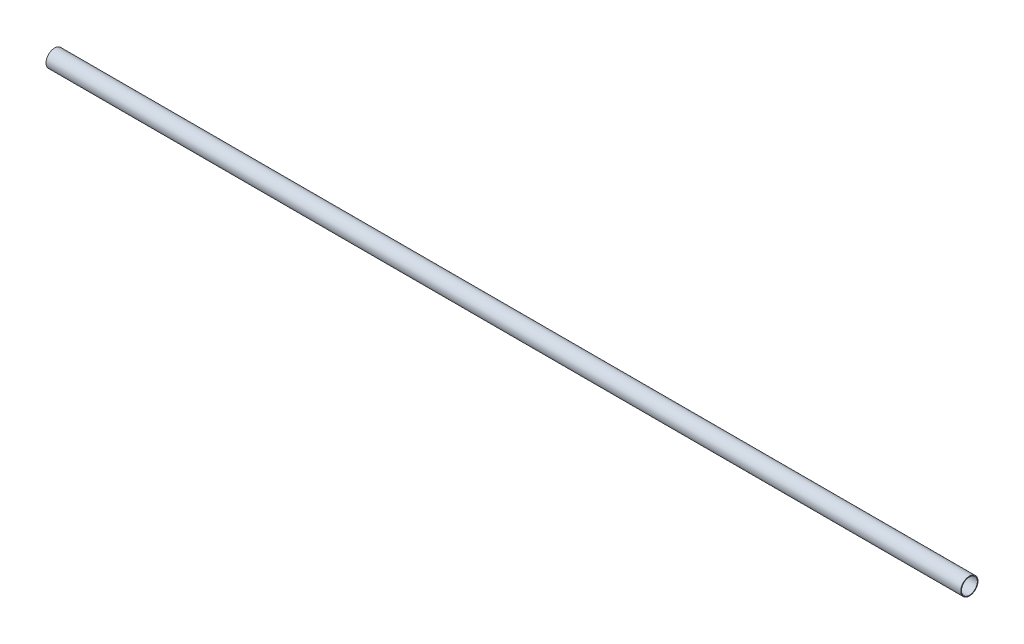
ISO-10303-21;
HEADER;
FILE_DESCRIPTION(('STEP AP214'),'2;1');
FILE_NAME('part.step','',(''),(''),'','','');
FILE_SCHEMA(('AUTOMOTIVE_DESIGN { 1 0 10303 214 1 1 1 1 }'));
ENDSEC;
DATA;
#1=APPLICATION_CONTEXT('core data for automotive mechanical design processes');
#2=APPLICATION_PROTOCOL_DEFINITION('international standard','automotive_design',2000,#1);
#3=PRODUCT_CONTEXT('',#1,'mechanical');
#4=PRODUCT('Part','Part','',(#3));
#5=PRODUCT_RELATED_PRODUCT_CATEGORY('part','',(#4));
#6=PRODUCT_DEFINITION_FORMATION('','',#4);
#7=PRODUCT_DEFINITION_CONTEXT('part definition',#1,'design');
#8=PRODUCT_DEFINITION('design','',#6,#7);
#9=PRODUCT_DEFINITION_SHAPE('','',#8);
#10=(LENGTH_UNIT() NAMED_UNIT(*) SI_UNIT(.MILLI.,.METRE.));
#11=(NAMED_UNIT(*) PLANE_ANGLE_UNIT() SI_UNIT($,.RADIAN.));
#12=(NAMED_UNIT(*) SI_UNIT($,.STERADIAN.) SOLID_ANGLE_UNIT());
#13=UNCERTAINTY_MEASURE_WITH_UNIT(LENGTH_MEASURE(1.E-05),#10,'distance_accuracy_value','');
#14=(GEOMETRIC_REPRESENTATION_CONTEXT(3) GLOBAL_UNCERTAINTY_ASSIGNED_CONTEXT((#13)) GLOBAL_UNIT_ASSIGNED_CONTEXT((#10,
#11,#12)) REPRESENTATION_CONTEXT('',''));
#15=CARTESIAN_POINT('',(0.,0.,0.));
#16=DIRECTION('',(0.,0.,1.));
#17=DIRECTION('',(1.,0.,0.));
#18=AXIS2_PLACEMENT_3D('',#15,#16,#17);
#19=CARTESIAN_POINT('',(1350.,0.,0.));
#20=DIRECTION('',(1.,0.,0.));
#21=DIRECTION('',(0.,0.,-1.));
#22=AXIS2_PLACEMENT_3D('',#19,#20,#21);
#23=PLANE('',#22);
#24=CARTESIAN_POINT('',(1350.,0.,0.));
#25=DIRECTION('',(1.,0.,0.));
#26=DIRECTION('',(0.,0.,-1.));
#27=AXIS2_PLACEMENT_3D('',#24,#25,#26);
#28=CIRCLE('',#27,25.4);
#29=CARTESIAN_POINT('',(1350.,0.,-25.4));
#30=VERTEX_POINT('',#29);
#31=EDGE_CURVE('E10',#30,#30,#28,.T.);
#32=ORIENTED_EDGE('',*,*,#31,.T.);
#33=EDGE_LOOP('',(#32));
#34=FACE_BOUND('',#33,.T.);
#35=CARTESIAN_POINT('',(1350.,0.,0.));
#36=DIRECTION('',(1.,0.,0.));
#37=DIRECTION('',(0.,0.,-1.));
#38=AXIS2_PLACEMENT_3D('',#35,#36,#37);
#39=CIRCLE('',#38,23.4);
#40=CARTESIAN_POINT('',(1350.,0.,-23.4));
#41=VERTEX_POINT('',#40);
#42=EDGE_CURVE('E42',#41,#41,#39,.T.);
#43=ORIENTED_EDGE('',*,*,#42,.F.);
#44=EDGE_LOOP('',(#43));
#45=FACE_BOUND('',#44,.T.);
#46=ADVANCED_FACE('F31',(#34,#45),#23,.T.);
#47=CARTESIAN_POINT('',(-1350.,0.,0.));
#48=DIRECTION('',(1.,0.,0.));
#49=DIRECTION('',(0.,0.,-1.));
#50=AXIS2_PLACEMENT_3D('',#47,#48,#49);
#51=PLANE('',#50);
#52=CARTESIAN_POINT('',(-1350.,0.,0.));
#53=DIRECTION('',(1.,0.,0.));
#54=DIRECTION('',(0.,0.,-1.));
#55=AXIS2_PLACEMENT_3D('',#52,#53,#54);
#56=CIRCLE('',#55,25.4);
#57=CARTESIAN_POINT('',(-1350.,0.,-25.4));
#58=VERTEX_POINT('',#57);
#59=EDGE_CURVE('E35',#58,#58,#56,.T.);
#60=ORIENTED_EDGE('',*,*,#59,.F.);
#61=EDGE_LOOP('',(#60));
#62=FACE_BOUND('',#61,.T.);
#63=CARTESIAN_POINT('',(-1350.,0.,0.));
#64=DIRECTION('',(1.,0.,0.));
#65=DIRECTION('',(0.,0.,-1.));
#66=AXIS2_PLACEMENT_3D('',#63,#64,#65);
#67=CIRCLE('',#66,23.4);
#68=CARTESIAN_POINT('',(-1350.,0.,-23.4));
#69=VERTEX_POINT('',#68);
#70=EDGE_CURVE('E44',#69,#69,#67,.T.);
#71=ORIENTED_EDGE('',*,*,#70,.T.);
#72=EDGE_LOOP('',(#71));
#73=FACE_BOUND('',#72,.T.);
#74=ADVANCED_FACE('F54',(#62,#73),#51,.F.);
#75=CARTESIAN_POINT('',(1350.,0.,0.));
#76=DIRECTION('',(-1.,0.,0.));
#77=DIRECTION('',(0.,0.,1.));
#78=AXIS2_PLACEMENT_3D('',#75,#76,#77);
#79=CYLINDRICAL_SURFACE('',#78,25.4);
#80=ORIENTED_EDGE('',*,*,#31,.F.);
#81=EDGE_LOOP('',(#80));
#82=FACE_BOUND('',#81,.T.);
#83=ORIENTED_EDGE('',*,*,#59,.T.);
#84=EDGE_LOOP('',(#83));
#85=FACE_BOUND('',#84,.T.);
#86=ADVANCED_FACE('F33',(#82,#85),#79,.T.);
#87=CARTESIAN_POINT('',(1350.,0.,0.));
#88=DIRECTION('',(-1.,0.,0.));
#89=DIRECTION('',(0.,0.,1.));
#90=AXIS2_PLACEMENT_3D('',#87,#88,#89);
#91=CYLINDRICAL_SURFACE('',#90,23.4);
#92=ORIENTED_EDGE('',*,*,#42,.T.);
#93=EDGE_LOOP('',(#92));
#94=FACE_BOUND('',#93,.T.);
#95=ORIENTED_EDGE('',*,*,#70,.F.);
#96=EDGE_LOOP('',(#95));
#97=FACE_BOUND('',#96,.T.);
#98=ADVANCED_FACE('F50',(#94,#97),#91,.F.);
#99=CLOSED_SHELL('',(#46,#74,#86,#98));
#100=MANIFOLD_SOLID_BREP('B2',#99);
#101=ADVANCED_BREP_SHAPE_REPRESENTATION('',(#18,#100),#14);
#102=SHAPE_DEFINITION_REPRESENTATION(#9,#101);
ENDSEC;
END-ISO-10303-21;
